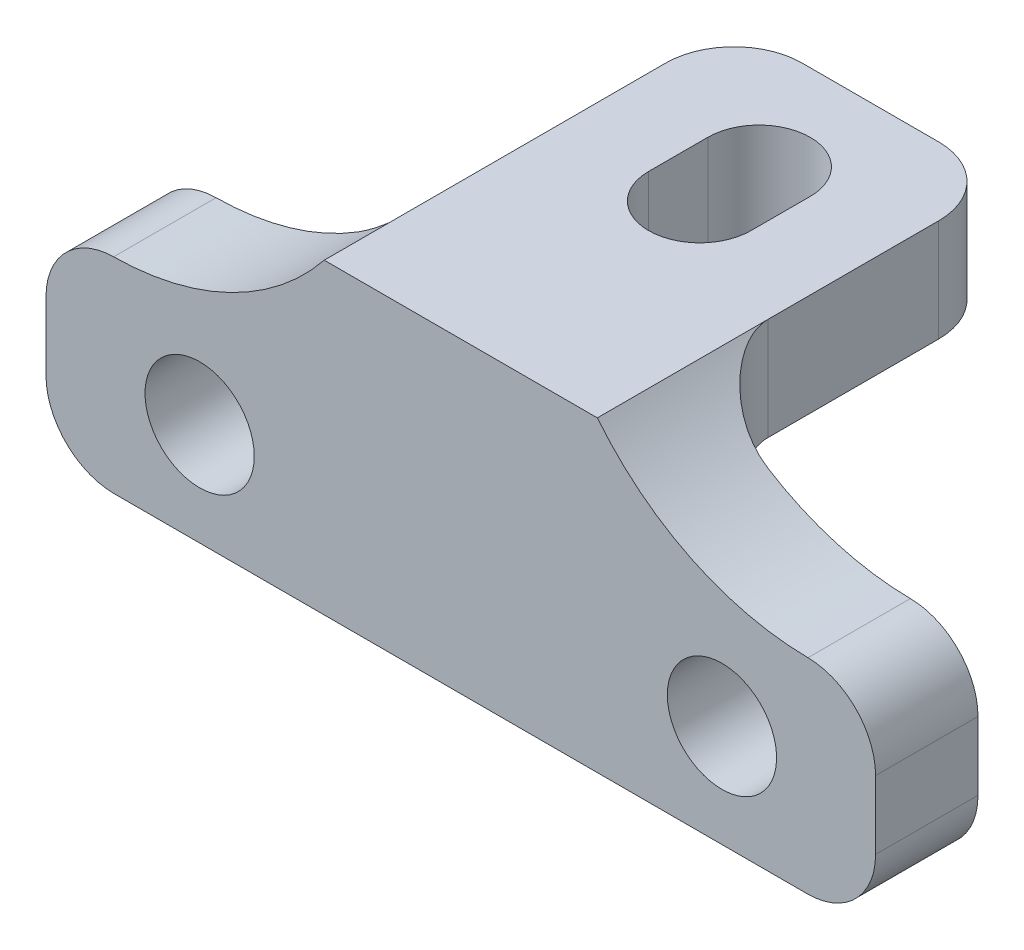
ISO-10303-21;
HEADER;
FILE_DESCRIPTION(('STEP AP214'),'2;1');
FILE_NAME('part.step','',(''),(''),'','','');
FILE_SCHEMA(('AUTOMOTIVE_DESIGN { 1 0 10303 214 1 1 1 1 }'));
ENDSEC;
DATA;
#1=APPLICATION_CONTEXT('core data for automotive mechanical design processes');
#2=APPLICATION_PROTOCOL_DEFINITION('international standard','automotive_design',2000,#1);
#3=PRODUCT_CONTEXT('',#1,'mechanical');
#4=PRODUCT('Part','Part','',(#3));
#5=PRODUCT_RELATED_PRODUCT_CATEGORY('part','',(#4));
#6=PRODUCT_DEFINITION_FORMATION('','',#4);
#7=PRODUCT_DEFINITION_CONTEXT('part definition',#1,'design');
#8=PRODUCT_DEFINITION('design','',#6,#7);
#9=PRODUCT_DEFINITION_SHAPE('','',#8);
#10=(LENGTH_UNIT() NAMED_UNIT(*) SI_UNIT(.MILLI.,.METRE.));
#11=(NAMED_UNIT(*) PLANE_ANGLE_UNIT() SI_UNIT($,.RADIAN.));
#12=(NAMED_UNIT(*) SI_UNIT($,.STERADIAN.) SOLID_ANGLE_UNIT());
#13=UNCERTAINTY_MEASURE_WITH_UNIT(LENGTH_MEASURE(1.E-05),#10,'distance_accuracy_value','');
#14=(GEOMETRIC_REPRESENTATION_CONTEXT(3) GLOBAL_UNCERTAINTY_ASSIGNED_CONTEXT((#13)) GLOBAL_UNIT_ASSIGNED_CONTEXT((#10,
#11,#12)) REPRESENTATION_CONTEXT('',''));
#15=CARTESIAN_POINT('',(0.,0.,0.));
#16=DIRECTION('',(0.,0.,1.));
#17=DIRECTION('',(1.,0.,0.));
#18=AXIS2_PLACEMENT_3D('',#15,#16,#17);
#19=CARTESIAN_POINT('',(-49.506989590494,24.6529411764706,-3.));
#20=DIRECTION('',(-1.,0.,0.));
#21=DIRECTION('',(0.,-1.,0.));
#22=AXIS2_PLACEMENT_3D('',#19,#20,#21);
#23=PLANE('',#22);
#24=DIRECTION('',(0.,-1.,0.));
#25=VECTOR('',#24,1.);
#26=CARTESIAN_POINT('',(-49.506989590494,24.6529411764706,0.));
#27=LINE('',#26,#25);
#28=CARTESIAN_POINT('',(-49.506989590494,22.6533924176365,0.));
#29=VERTEX_POINT('',#28);
#30=CARTESIAN_POINT('',(-49.506989590494,20.6529411764706,0.));
#31=VERTEX_POINT('',#30);
#32=EDGE_CURVE('E250',#29,#31,#27,.T.);
#33=ORIENTED_EDGE('',*,*,#32,.F.);
#34=DIRECTION('',(0.,0.,1.));
#35=VECTOR('',#34,1.);
#36=CARTESIAN_POINT('',(-49.506989590494,22.6533924176365,-3.));
#37=LINE('',#36,#35);
#38=CARTESIAN_POINT('',(-49.506989590494,22.6533924176365,-3.));
#39=VERTEX_POINT('',#38);
#40=EDGE_CURVE('E347',#29,#39,#37,.F.);
#41=ORIENTED_EDGE('',*,*,#40,.T.);
#42=DIRECTION('',(0.,-1.,0.));
#43=VECTOR('',#42,1.);
#44=CARTESIAN_POINT('',(-49.506989590494,24.6529411764706,-3.));
#45=LINE('',#44,#43);
#46=CARTESIAN_POINT('',(-49.506989590494,20.6529411764706,-3.));
#47=VERTEX_POINT('',#46);
#48=EDGE_CURVE('E253',#39,#47,#45,.T.);
#49=ORIENTED_EDGE('',*,*,#48,.T.);
#50=DIRECTION('',(0.,0.,1.));
#51=VECTOR('',#50,1.);
#52=CARTESIAN_POINT('',(-49.506989590494,20.6529411764706,-3.));
#53=LINE('',#52,#51);
#54=EDGE_CURVE('E344',#47,#31,#53,.T.);
#55=ORIENTED_EDGE('',*,*,#54,.T.);
#56=EDGE_LOOP('',(#33,#41,#49,#55));
#57=FACE_BOUND('',#56,.T.);
#58=ADVANCED_FACE('F37',(#57),#23,.T.);
#59=CARTESIAN_POINT('',(-25.206989590494,24.6529411764706,-3.));
#60=DIRECTION('',(1.,0.,0.));
#61=DIRECTION('',(0.,0.,-1.));
#62=AXIS2_PLACEMENT_3D('',#59,#60,#61);
#63=PLANE('',#62);
#64=DIRECTION('',(0.,1.,0.));
#65=VECTOR('',#64,1.);
#66=CARTESIAN_POINT('',(-25.206989590494,24.6529411764706,-3.));
#67=LINE('',#66,#65);
#68=CARTESIAN_POINT('',(-25.206989590494,20.6529411764706,-3.));
#69=VERTEX_POINT('',#68);
#70=CARTESIAN_POINT('',(-25.206989590494,22.6533924176365,-3.));
#71=VERTEX_POINT('',#70);
#72=EDGE_CURVE('E260',#69,#71,#67,.T.);
#73=ORIENTED_EDGE('',*,*,#72,.T.);
#74=DIRECTION('',(0.,0.,-1.));
#75=VECTOR('',#74,1.);
#76=CARTESIAN_POINT('',(-25.206989590494,22.6533924176365,0.));
#77=LINE('',#76,#75);
#78=CARTESIAN_POINT('',(-25.206989590494,22.6533924176365,0.));
#79=VERTEX_POINT('',#78);
#80=EDGE_CURVE('E323',#71,#79,#77,.F.);
#81=ORIENTED_EDGE('',*,*,#80,.T.);
#82=DIRECTION('',(0.,1.,0.));
#83=VECTOR('',#82,1.);
#84=CARTESIAN_POINT('',(-25.206989590494,24.6529411764706,0.));
#85=LINE('',#84,#83);
#86=CARTESIAN_POINT('',(-25.206989590494,20.6529411764706,0.));
#87=VERTEX_POINT('',#86);
#88=EDGE_CURVE('E257',#87,#79,#85,.T.);
#89=ORIENTED_EDGE('',*,*,#88,.F.);
#90=DIRECTION('',(0.,0.,1.));
#91=VECTOR('',#90,1.);
#92=CARTESIAN_POINT('',(-25.206989590494,20.6529411764706,-3.));
#93=LINE('',#92,#91);
#94=EDGE_CURVE('E321',#87,#69,#93,.F.);
#95=ORIENTED_EDGE('',*,*,#94,.T.);
#96=EDGE_LOOP('',(#73,#81,#89,#95));
#97=FACE_BOUND('',#96,.T.);
#98=ADVANCED_FACE('F404',(#97),#63,.T.);
#99=CARTESIAN_POINT('',(-49.506989590494,18.6529411764706,-3.));
#100=DIRECTION('',(0.,-1.,0.));
#101=DIRECTION('',(1.,0.,0.));
#102=AXIS2_PLACEMENT_3D('',#99,#100,#101);
#103=PLANE('',#102);
#104=DIRECTION('',(1.,0.,0.));
#105=VECTOR('',#104,1.);
#106=CARTESIAN_POINT('',(-49.506989590494,18.6529411764706,-3.));
#107=LINE('',#106,#105);
#108=CARTESIAN_POINT('',(-47.506989590494,18.6529411764706,-3.));
#109=VERTEX_POINT('',#108);
#110=CARTESIAN_POINT('',(-27.206989590494,18.6529411764706,-3.));
#111=VERTEX_POINT('',#110);
#112=EDGE_CURVE('E256',#109,#111,#107,.T.);
#113=ORIENTED_EDGE('',*,*,#112,.T.);
#114=DIRECTION('',(0.,0.,1.));
#115=VECTOR('',#114,1.);
#116=CARTESIAN_POINT('',(-27.206989590494,18.6529411764706,-3.));
#117=LINE('',#116,#115);
#118=CARTESIAN_POINT('',(-27.206989590494,18.6529411764706,0.));
#119=VERTEX_POINT('',#118);
#120=EDGE_CURVE('E338',#111,#119,#117,.T.);
#121=ORIENTED_EDGE('',*,*,#120,.T.);
#122=DIRECTION('',(1.,0.,0.));
#123=VECTOR('',#122,1.);
#124=CARTESIAN_POINT('',(-49.506989590494,18.6529411764706,0.));
#125=LINE('',#124,#123);
#126=CARTESIAN_POINT('',(-47.506989590494,18.6529411764706,0.));
#127=VERTEX_POINT('',#126);
#128=EDGE_CURVE('E266',#127,#119,#125,.T.);
#129=ORIENTED_EDGE('',*,*,#128,.F.);
#130=DIRECTION('',(0.,0.,1.));
#131=VECTOR('',#130,1.);
#132=CARTESIAN_POINT('',(-47.506989590494,18.6529411764706,-3.));
#133=LINE('',#132,#131);
#134=EDGE_CURVE('E336',#127,#109,#133,.F.);
#135=ORIENTED_EDGE('',*,*,#134,.T.);
#136=EDGE_LOOP('',(#113,#121,#129,#135));
#137=FACE_BOUND('',#136,.T.);
#138=ADVANCED_FACE('F409',(#137),#103,.T.);
#139=CARTESIAN_POINT('',(0.,0.,-3.));
#140=DIRECTION('',(0.,0.,1.));
#141=DIRECTION('',(1.,0.,0.));
#142=AXIS2_PLACEMENT_3D('',#139,#140,#141);
#143=PLANE('',#142);
#144=CARTESIAN_POINT('',(-29.706989590494,21.6529411764706,-3.));
#145=DIRECTION('',(0.,0.,1.));
#146=DIRECTION('',(-1.,0.,0.));
#147=AXIS2_PLACEMENT_3D('',#144,#145,#146);
#148=CIRCLE('',#147,1.6);
#149=CARTESIAN_POINT('',(-31.306989590494,21.6529411764706,-3.));
#150=VERTEX_POINT('',#149);
#151=EDGE_CURVE('E241',#150,#150,#148,.T.);
#152=ORIENTED_EDGE('',*,*,#151,.T.);
#153=EDGE_LOOP('',(#152));
#154=FACE_BOUND('',#153,.T.);
#155=CARTESIAN_POINT('',(-45.006989590494,21.6529411764706,-3.));
#156=DIRECTION('',(0.,0.,1.));
#157=DIRECTION('',(1.,0.,0.));
#158=AXIS2_PLACEMENT_3D('',#155,#156,#157);
#159=CIRCLE('',#158,1.6);
#160=CARTESIAN_POINT('',(-43.406989590494,21.6529411764706,-3.));
#161=VERTEX_POINT('',#160);
#162=EDGE_CURVE('E247',#161,#161,#159,.T.);
#163=ORIENTED_EDGE('',*,*,#162,.T.);
#164=EDGE_LOOP('',(#163));
#165=FACE_BOUND('',#164,.T.);
#166=CARTESIAN_POINT('',(-27.1119915920956,32.6529411764706,-3.));
#167=DIRECTION('',(0.,0.,1.));
#168=DIRECTION('',(1.,0.,0.));
#169=AXIS2_PLACEMENT_3D('',#166,#167,#168);
#170=CIRCLE('',#169,8.);
#171=CARTESIAN_POINT('',(-31.356989590494,25.8720863635732,-3.));
#172=VERTEX_POINT('',#171);
#173=CARTESIAN_POINT('',(-27.1879899908143,24.6533021694033,-3.));
#174=VERTEX_POINT('',#173);
#175=EDGE_CURVE('E263',#172,#174,#170,.T.);
#176=ORIENTED_EDGE('',*,*,#175,.T.);
#177=CARTESIAN_POINT('',(-27.206989590494,22.6533924176365,-3.));
#178=DIRECTION('',(0.,0.,1.));
#179=DIRECTION('',(1.,0.,0.));
#180=AXIS2_PLACEMENT_3D('',#177,#178,#179);
#181=CIRCLE('',#180,2.);
#182=EDGE_CURVE('E298',#174,#71,#181,.F.);
#183=ORIENTED_EDGE('',*,*,#182,.T.);
#184=ORIENTED_EDGE('',*,*,#72,.F.);
#185=CARTESIAN_POINT('',(-27.206989590494,20.6529411764706,-3.));
#186=DIRECTION('',(0.,0.,1.));
#187=DIRECTION('',(1.,0.,0.));
#188=AXIS2_PLACEMENT_3D('',#185,#186,#187);
#189=CIRCLE('',#188,2.);
#190=EDGE_CURVE('E296',#69,#111,#189,.F.);
#191=ORIENTED_EDGE('',*,*,#190,.T.);
#192=ORIENTED_EDGE('',*,*,#112,.F.);
#193=CARTESIAN_POINT('',(-47.506989590494,20.6529411764706,-3.));
#194=DIRECTION('',(0.,0.,1.));
#195=DIRECTION('',(1.,0.,0.));
#196=AXIS2_PLACEMENT_3D('',#193,#194,#195);
#197=CIRCLE('',#196,2.);
#198=EDGE_CURVE('E292',#109,#47,#197,.F.);
#199=ORIENTED_EDGE('',*,*,#198,.T.);
#200=ORIENTED_EDGE('',*,*,#48,.F.);
#201=CARTESIAN_POINT('',(-47.506989590494,22.6533924176365,-3.));
#202=DIRECTION('',(0.,0.,1.));
#203=DIRECTION('',(1.,0.,0.));
#204=AXIS2_PLACEMENT_3D('',#201,#202,#203);
#205=CIRCLE('',#204,2.);
#206=CARTESIAN_POINT('',(-47.5259891901736,24.6533021694033,-3.));
#207=VERTEX_POINT('',#206);
#208=EDGE_CURVE('E294',#39,#207,#205,.F.);
#209=ORIENTED_EDGE('',*,*,#208,.T.);
#210=CARTESIAN_POINT('',(-47.6019875888923,32.6529411764706,-3.));
#211=DIRECTION('',(0.,0.,1.));
#212=DIRECTION('',(1.,0.,0.));
#213=AXIS2_PLACEMENT_3D('',#210,#211,#212);
#214=CIRCLE('',#213,8.);
#215=CARTESIAN_POINT('',(-43.356989590494,25.8720863635732,-3.));
#216=VERTEX_POINT('',#215);
#217=EDGE_CURVE('E278',#207,#216,#214,.T.);
#218=ORIENTED_EDGE('',*,*,#217,.T.);
#219=DIRECTION('',(0.,1.,0.));
#220=VECTOR('',#219,1.);
#221=CARTESIAN_POINT('',(-43.356989590494,24.6529411764706,-3.));
#222=LINE('',#221,#220);
#223=CARTESIAN_POINT('',(-43.356989590494,22.6529411764706,-3.));
#224=VERTEX_POINT('',#223);
#225=EDGE_CURVE('E288',#216,#224,#222,.F.);
#226=ORIENTED_EDGE('',*,*,#225,.T.);
#227=DIRECTION('',(-1.,0.,0.));
#228=VECTOR('',#227,1.);
#229=CARTESIAN_POINT('',(0.,22.6529411764706,-3.));
#230=LINE('',#229,#228);
#231=CARTESIAN_POINT('',(-31.356989590494,22.6529411764706,-3.));
#232=VERTEX_POINT('',#231);
#233=EDGE_CURVE('E286',#224,#232,#230,.F.);
#234=ORIENTED_EDGE('',*,*,#233,.T.);
#235=DIRECTION('',(0.,-1.,0.));
#236=VECTOR('',#235,1.);
#237=CARTESIAN_POINT('',(-31.356989590494,27.6529411764706,-3.));
#238=LINE('',#237,#236);
#239=EDGE_CURVE('E290',#232,#172,#238,.F.);
#240=ORIENTED_EDGE('',*,*,#239,.T.);
#241=EDGE_LOOP('',(#176,#183,#184,#191,#192,#199,#200,#209,#218,#226,#234,#240));
#242=FACE_BOUND('',#241,.T.);
#243=ADVANCED_FACE('F415',(#154,#165,#242),#143,.F.);
#244=CARTESIAN_POINT('',(0.,0.,0.));
#245=DIRECTION('',(0.,0.,1.));
#246=DIRECTION('',(1.,0.,0.));
#247=AXIS2_PLACEMENT_3D('',#244,#245,#246);
#248=PLANE('',#247);
#249=CARTESIAN_POINT('',(-29.706989590494,21.6529411764706,0.));
#250=DIRECTION('',(0.,0.,1.));
#251=DIRECTION('',(-1.,0.,0.));
#252=AXIS2_PLACEMENT_3D('',#249,#250,#251);
#253=CIRCLE('',#252,1.6);
#254=CARTESIAN_POINT('',(-31.306989590494,21.6529411764706,0.));
#255=VERTEX_POINT('',#254);
#256=EDGE_CURVE('E232',#255,#255,#253,.T.);
#257=ORIENTED_EDGE('',*,*,#256,.F.);
#258=EDGE_LOOP('',(#257));
#259=FACE_BOUND('',#258,.T.);
#260=CARTESIAN_POINT('',(-45.006989590494,21.6529411764706,0.));
#261=DIRECTION('',(0.,0.,1.));
#262=DIRECTION('',(1.,0.,0.));
#263=AXIS2_PLACEMENT_3D('',#260,#261,#262);
#264=CIRCLE('',#263,1.6);
#265=CARTESIAN_POINT('',(-43.406989590494,21.6529411764706,0.));
#266=VERTEX_POINT('',#265);
#267=EDGE_CURVE('E244',#266,#266,#264,.T.);
#268=ORIENTED_EDGE('',*,*,#267,.F.);
#269=EDGE_LOOP('',(#268));
#270=FACE_BOUND('',#269,.T.);
#271=ORIENTED_EDGE('',*,*,#88,.T.);
#272=CARTESIAN_POINT('',(-27.206989590494,22.6533924176365,0.));
#273=DIRECTION('',(0.,0.,1.));
#274=DIRECTION('',(1.,0.,0.));
#275=AXIS2_PLACEMENT_3D('',#272,#273,#274);
#276=CIRCLE('',#275,2.);
#277=CARTESIAN_POINT('',(-27.1879899908143,24.6533021694033,0.));
#278=VERTEX_POINT('',#277);
#279=EDGE_CURVE('E332',#79,#278,#276,.T.);
#280=ORIENTED_EDGE('',*,*,#279,.T.);
#281=CARTESIAN_POINT('',(-27.1119915920956,32.6529411764706,0.));
#282=DIRECTION('',(0.,0.,1.));
#283=DIRECTION('',(1.,0.,0.));
#284=AXIS2_PLACEMENT_3D('',#281,#282,#283);
#285=CIRCLE('',#284,8.);
#286=CARTESIAN_POINT('',(-33.356989590494,27.6529411764706,0.));
#287=VERTEX_POINT('',#286);
#288=EDGE_CURVE('E273',#278,#287,#285,.F.);
#289=ORIENTED_EDGE('',*,*,#288,.T.);
#290=DIRECTION('',(1.,0.,0.));
#291=VECTOR('',#290,1.);
#292=CARTESIAN_POINT('',(-41.356989590494,27.6529411764706,0.));
#293=LINE('',#292,#291);
#294=CARTESIAN_POINT('',(-41.356989590494,27.6529411764706,0.));
#295=VERTEX_POINT('',#294);
#296=EDGE_CURVE('E224',#295,#287,#293,.T.);
#297=ORIENTED_EDGE('',*,*,#296,.F.);
#298=CARTESIAN_POINT('',(-47.6019875888923,32.6529411764706,0.));
#299=DIRECTION('',(0.,0.,1.));
#300=DIRECTION('',(1.,0.,0.));
#301=AXIS2_PLACEMENT_3D('',#298,#299,#300);
#302=CIRCLE('',#301,8.);
#303=CARTESIAN_POINT('',(-47.5259891901736,24.6533021694033,0.));
#304=VERTEX_POINT('',#303);
#305=EDGE_CURVE('E275',#295,#304,#302,.F.);
#306=ORIENTED_EDGE('',*,*,#305,.T.);
#307=CARTESIAN_POINT('',(-47.506989590494,22.6533924176365,0.));
#308=DIRECTION('',(0.,0.,1.));
#309=DIRECTION('',(1.,0.,0.));
#310=AXIS2_PLACEMENT_3D('',#307,#308,#309);
#311=CIRCLE('',#310,2.);
#312=EDGE_CURVE('E328',#304,#29,#311,.T.);
#313=ORIENTED_EDGE('',*,*,#312,.T.);
#314=ORIENTED_EDGE('',*,*,#32,.T.);
#315=CARTESIAN_POINT('',(-47.506989590494,20.6529411764706,0.));
#316=DIRECTION('',(0.,0.,1.));
#317=DIRECTION('',(1.,0.,0.));
#318=AXIS2_PLACEMENT_3D('',#315,#316,#317);
#319=CIRCLE('',#318,2.);
#320=EDGE_CURVE('E326',#31,#127,#319,.T.);
#321=ORIENTED_EDGE('',*,*,#320,.T.);
#322=ORIENTED_EDGE('',*,*,#128,.T.);
#323=CARTESIAN_POINT('',(-27.206989590494,20.6529411764706,0.));
#324=DIRECTION('',(0.,0.,1.));
#325=DIRECTION('',(1.,0.,0.));
#326=AXIS2_PLACEMENT_3D('',#323,#324,#325);
#327=CIRCLE('',#326,2.);
#328=EDGE_CURVE('E330',#119,#87,#327,.T.);
#329=ORIENTED_EDGE('',*,*,#328,.T.);
#330=EDGE_LOOP('',(#271,#280,#289,#297,#306,#313,#314,#321,#322,#329));
#331=FACE_BOUND('',#330,.T.);
#332=ADVANCED_FACE('F418',(#259,#270,#331),#248,.T.);
#333=CARTESIAN_POINT('',(-45.006989590494,21.6529411764706,-3.));
#334=DIRECTION('',(0.,0.,1.));
#335=DIRECTION('',(1.,0.,0.));
#336=AXIS2_PLACEMENT_3D('',#333,#334,#335);
#337=CYLINDRICAL_SURFACE('',#336,1.6);
#338=ORIENTED_EDGE('',*,*,#162,.F.);
#339=EDGE_LOOP('',(#338));
#340=FACE_BOUND('',#339,.T.);
#341=ORIENTED_EDGE('',*,*,#267,.T.);
#342=EDGE_LOOP('',(#341));
#343=FACE_BOUND('',#342,.T.);
#344=ADVANCED_FACE('F421',(#340,#343),#337,.F.);
#345=CARTESIAN_POINT('',(-29.706989590494,21.6529411764706,-3.));
#346=DIRECTION('',(0.,0.,1.));
#347=DIRECTION('',(1.,0.,0.));
#348=AXIS2_PLACEMENT_3D('',#345,#346,#347);
#349=CYLINDRICAL_SURFACE('',#348,1.6);
#350=ORIENTED_EDGE('',*,*,#151,.F.);
#351=EDGE_LOOP('',(#350));
#352=FACE_BOUND('',#351,.T.);
#353=ORIENTED_EDGE('',*,*,#256,.T.);
#354=EDGE_LOOP('',(#353));
#355=FACE_BOUND('',#354,.T.);
#356=ADVANCED_FACE('F428',(#352,#355),#349,.F.);
#357=CARTESIAN_POINT('',(0.,27.6529411764706,0.));
#358=DIRECTION('',(0.,-1.,0.));
#359=DIRECTION('',(0.,0.,-1.));
#360=AXIS2_PLACEMENT_3D('',#357,#358,#359);
#361=PLANE('',#360);
#362=DIRECTION('',(-1.,0.,0.));
#363=VECTOR('',#362,1.);
#364=CARTESIAN_POINT('',(-41.356989590494,27.6529411764706,-12.));
#365=LINE('',#364,#363);
#366=CARTESIAN_POINT('',(-35.356989590494,27.6529411764706,-12.));
#367=VERTEX_POINT('',#366);
#368=CARTESIAN_POINT('',(-39.356989590494,27.6529411764706,-12.));
#369=VERTEX_POINT('',#368);
#370=EDGE_CURVE('E229',#367,#369,#365,.T.);
#371=ORIENTED_EDGE('',*,*,#370,.T.);
#372=CARTESIAN_POINT('',(-39.356989590494,27.6529411764706,-10.));
#373=DIRECTION('',(0.,-1.,0.));
#374=DIRECTION('',(0.,0.,-1.));
#375=AXIS2_PLACEMENT_3D('',#372,#373,#374);
#376=CIRCLE('',#375,2.);
#377=CARTESIAN_POINT('',(-41.356989590494,27.6529411764706,-10.));
#378=VERTEX_POINT('',#377);
#379=EDGE_CURVE('E319',#369,#378,#376,.F.);
#380=ORIENTED_EDGE('',*,*,#379,.T.);
#381=DIRECTION('',(0.,0.,1.));
#382=VECTOR('',#381,1.);
#383=CARTESIAN_POINT('',(-41.356989590494,27.6529411764706,0.));
#384=LINE('',#383,#382);
#385=CARTESIAN_POINT('',(-41.356989590494,27.6529411764706,-5.));
#386=VERTEX_POINT('',#385);
#387=EDGE_CURVE('E221',#378,#386,#384,.T.);
#388=ORIENTED_EDGE('',*,*,#387,.T.);
#389=EDGE_CURVE('E225',#386,#295,#384,.T.);
#390=ORIENTED_EDGE('',*,*,#389,.T.);
#391=ORIENTED_EDGE('',*,*,#296,.T.);
#392=DIRECTION('',(0.,0.,-1.));
#393=VECTOR('',#392,1.);
#394=CARTESIAN_POINT('',(-33.356989590494,27.6529411764706,0.));
#395=LINE('',#394,#393);
#396=CARTESIAN_POINT('',(-33.356989590494,27.6529411764706,-5.));
#397=VERTEX_POINT('',#396);
#398=EDGE_CURVE('E55',#287,#397,#395,.T.);
#399=ORIENTED_EDGE('',*,*,#398,.T.);
#400=CARTESIAN_POINT('',(-33.356989590494,27.6529411764706,-10.));
#401=VERTEX_POINT('',#400);
#402=EDGE_CURVE('E227',#397,#401,#395,.T.);
#403=ORIENTED_EDGE('',*,*,#402,.T.);
#404=CARTESIAN_POINT('',(-35.356989590494,27.6529411764706,-10.));
#405=DIRECTION('',(0.,-1.,0.));
#406=DIRECTION('',(0.,0.,-1.));
#407=AXIS2_PLACEMENT_3D('',#404,#405,#406);
#408=CIRCLE('',#407,2.);
#409=EDGE_CURVE('E317',#401,#367,#408,.F.);
#410=ORIENTED_EDGE('',*,*,#409,.T.);
#411=EDGE_LOOP('',(#371,#380,#388,#390,#391,#399,#403,#410));
#412=FACE_BOUND('',#411,.T.);
#413=CARTESIAN_POINT('',(-37.356989590494,27.6529411764706,-8.7354193943524));
#414=DIRECTION('',(0.,1.,0.));
#415=DIRECTION('',(0.,0.,1.));
#416=AXIS2_PLACEMENT_3D('',#413,#414,#415);
#417=CIRCLE('',#416,1.49999999999999);
#418=CARTESIAN_POINT('',(-35.856989590494,27.6529411764706,-8.7354193943524));
#419=VERTEX_POINT('',#418);
#420=CARTESIAN_POINT('',(-38.856989590494,27.6529411764706,-8.7354193943524));
#421=VERTEX_POINT('',#420);
#422=EDGE_CURVE('E179',#419,#421,#417,.T.);
#423=ORIENTED_EDGE('',*,*,#422,.F.);
#424=DIRECTION('',(0.,0.,-1.));
#425=VECTOR('',#424,1.);
#426=CARTESIAN_POINT('',(-35.856989590494,27.6529411764706,-8.7354193943524));
#427=LINE('',#426,#425);
#428=CARTESIAN_POINT('',(-35.856989590494,27.6529411764706,-7.));
#429=VERTEX_POINT('',#428);
#430=EDGE_CURVE('E205',#429,#419,#427,.T.);
#431=ORIENTED_EDGE('',*,*,#430,.F.);
#432=CARTESIAN_POINT('',(-37.356989590494,27.6529411764706,-7.));
#433=DIRECTION('',(0.,1.,0.));
#434=DIRECTION('',(0.,0.,1.));
#435=AXIS2_PLACEMENT_3D('',#432,#433,#434);
#436=CIRCLE('',#435,1.49999999999999);
#437=CARTESIAN_POINT('',(-38.856989590494,27.6529411764706,-7.));
#438=VERTEX_POINT('',#437);
#439=EDGE_CURVE('E203',#438,#429,#436,.T.);
#440=ORIENTED_EDGE('',*,*,#439,.F.);
#441=DIRECTION('',(0.,0.,1.));
#442=VECTOR('',#441,1.);
#443=CARTESIAN_POINT('',(-38.856989590494,27.6529411764706,-8.7354193943524));
#444=LINE('',#443,#442);
#445=EDGE_CURVE('E189',#421,#438,#444,.T.);
#446=ORIENTED_EDGE('',*,*,#445,.F.);
#447=EDGE_LOOP('',(#423,#431,#440,#446));
#448=FACE_BOUND('',#447,.T.);
#449=ADVANCED_FACE('F201',(#412,#448),#361,.F.);
#450=CARTESIAN_POINT('',(0.,24.6529411764706,0.));
#451=DIRECTION('',(0.,-1.,0.));
#452=DIRECTION('',(0.,0.,-1.));
#453=AXIS2_PLACEMENT_3D('',#450,#451,#452);
#454=PLANE('',#453);
#455=DIRECTION('',(0.,0.,1.));
#456=VECTOR('',#455,1.);
#457=CARTESIAN_POINT('',(-41.356989590494,24.6529411764706,0.));
#458=LINE('',#457,#456);
#459=CARTESIAN_POINT('',(-41.356989590494,24.6529411764706,-10.));
#460=VERTEX_POINT('',#459);
#461=CARTESIAN_POINT('',(-41.356989590494,24.6529411764706,-5.));
#462=VERTEX_POINT('',#461);
#463=EDGE_CURVE('E197',#460,#462,#458,.T.);
#464=ORIENTED_EDGE('',*,*,#463,.F.);
#465=CARTESIAN_POINT('',(-39.356989590494,24.6529411764706,-10.));
#466=DIRECTION('',(0.,-1.,0.));
#467=DIRECTION('',(0.,0.,-1.));
#468=AXIS2_PLACEMENT_3D('',#465,#466,#467);
#469=CIRCLE('',#468,2.);
#470=CARTESIAN_POINT('',(-39.356989590494,24.6529411764706,-12.));
#471=VERTEX_POINT('',#470);
#472=EDGE_CURVE('E310',#460,#471,#469,.T.);
#473=ORIENTED_EDGE('',*,*,#472,.T.);
#474=DIRECTION('',(-1.,0.,0.));
#475=VECTOR('',#474,1.);
#476=CARTESIAN_POINT('',(-41.356989590494,24.6529411764706,-12.));
#477=LINE('',#476,#475);
#478=CARTESIAN_POINT('',(-35.356989590494,24.6529411764706,-12.));
#479=VERTEX_POINT('',#478);
#480=EDGE_CURVE('E238',#479,#471,#477,.T.);
#481=ORIENTED_EDGE('',*,*,#480,.F.);
#482=CARTESIAN_POINT('',(-35.356989590494,24.6529411764706,-10.));
#483=DIRECTION('',(0.,-1.,0.));
#484=DIRECTION('',(0.,0.,-1.));
#485=AXIS2_PLACEMENT_3D('',#482,#483,#484);
#486=CIRCLE('',#485,2.);
#487=CARTESIAN_POINT('',(-33.356989590494,24.6529411764706,-10.));
#488=VERTEX_POINT('',#487);
#489=EDGE_CURVE('E308',#479,#488,#486,.T.);
#490=ORIENTED_EDGE('',*,*,#489,.T.);
#491=DIRECTION('',(0.,0.,-1.));
#492=VECTOR('',#491,1.);
#493=CARTESIAN_POINT('',(-33.356989590494,24.6529411764706,0.));
#494=LINE('',#493,#492);
#495=CARTESIAN_POINT('',(-33.356989590494,24.6529411764706,-5.));
#496=VERTEX_POINT('',#495);
#497=EDGE_CURVE('E235',#496,#488,#494,.T.);
#498=ORIENTED_EDGE('',*,*,#497,.F.);
#499=DIRECTION('',(-1.,0.,0.));
#500=VECTOR('',#499,1.);
#501=CARTESIAN_POINT('',(0.,24.6529411764706,-5.));
#502=LINE('',#501,#500);
#503=EDGE_CURVE('E306',#496,#462,#502,.T.);
#504=ORIENTED_EDGE('',*,*,#503,.T.);
#505=EDGE_LOOP('',(#464,#473,#481,#490,#498,#504));
#506=FACE_BOUND('',#505,.T.);
#507=DIRECTION('',(0.,0.,-1.));
#508=VECTOR('',#507,1.);
#509=CARTESIAN_POINT('',(-35.856989590494,24.6529411764706,-8.7354193943524));
#510=LINE('',#509,#508);
#511=CARTESIAN_POINT('',(-35.856989590494,24.6529411764706,-7.));
#512=VERTEX_POINT('',#511);
#513=CARTESIAN_POINT('',(-35.856989590494,24.6529411764706,-8.7354193943524));
#514=VERTEX_POINT('',#513);
#515=EDGE_CURVE('E190',#512,#514,#510,.T.);
#516=ORIENTED_EDGE('',*,*,#515,.T.);
#517=CARTESIAN_POINT('',(-37.356989590494,24.6529411764706,-8.7354193943524));
#518=DIRECTION('',(0.,1.,0.));
#519=DIRECTION('',(0.,0.,1.));
#520=AXIS2_PLACEMENT_3D('',#517,#518,#519);
#521=CIRCLE('',#520,1.49999999999999);
#522=CARTESIAN_POINT('',(-38.856989590494,24.6529411764706,-8.7354193943524));
#523=VERTEX_POINT('',#522);
#524=EDGE_CURVE('E209',#514,#523,#521,.T.);
#525=ORIENTED_EDGE('',*,*,#524,.T.);
#526=DIRECTION('',(0.,0.,1.));
#527=VECTOR('',#526,1.);
#528=CARTESIAN_POINT('',(-38.856989590494,24.6529411764706,-8.7354193943524));
#529=LINE('',#528,#527);
#530=CARTESIAN_POINT('',(-38.856989590494,24.6529411764706,-7.));
#531=VERTEX_POINT('',#530);
#532=EDGE_CURVE('E196',#523,#531,#529,.T.);
#533=ORIENTED_EDGE('',*,*,#532,.T.);
#534=CARTESIAN_POINT('',(-37.356989590494,24.6529411764706,-7.));
#535=DIRECTION('',(0.,1.,0.));
#536=DIRECTION('',(0.,0.,1.));
#537=AXIS2_PLACEMENT_3D('',#534,#535,#536);
#538=CIRCLE('',#537,1.49999999999999);
#539=EDGE_CURVE('E212',#531,#512,#538,.T.);
#540=ORIENTED_EDGE('',*,*,#539,.T.);
#541=EDGE_LOOP('',(#516,#525,#533,#540));
#542=FACE_BOUND('',#541,.T.);
#543=ADVANCED_FACE('F437',(#506,#542),#454,.T.);
#544=CARTESIAN_POINT('',(-41.356989590494,27.6529411764706,0.));
#545=DIRECTION('',(1.,0.,0.));
#546=DIRECTION('',(0.,0.,-1.));
#547=AXIS2_PLACEMENT_3D('',#544,#545,#546);
#548=PLANE('',#547);
#549=ORIENTED_EDGE('',*,*,#463,.T.);
#550=DIRECTION('',(0.,1.,0.));
#551=VECTOR('',#550,1.);
#552=CARTESIAN_POINT('',(-41.356989590494,27.6529411764706,-5.));
#553=LINE('',#552,#551);
#554=EDGE_CURVE('E303',#462,#386,#553,.T.);
#555=ORIENTED_EDGE('',*,*,#554,.T.);
#556=ORIENTED_EDGE('',*,*,#387,.F.);
#557=DIRECTION('',(0.,-1.,0.));
#558=VECTOR('',#557,1.);
#559=CARTESIAN_POINT('',(-41.356989590494,27.6529411764706,-10.));
#560=LINE('',#559,#558);
#561=EDGE_CURVE('E300',#378,#460,#560,.T.);
#562=ORIENTED_EDGE('',*,*,#561,.T.);
#563=EDGE_LOOP('',(#549,#555,#556,#562));
#564=FACE_BOUND('',#563,.T.);
#565=ADVANCED_FACE('F433',(#564),#548,.F.);
#566=CARTESIAN_POINT('',(-33.356989590494,27.6529411764706,0.));
#567=DIRECTION('',(-1.,0.,0.));
#568=DIRECTION('',(0.,0.,1.));
#569=AXIS2_PLACEMENT_3D('',#566,#567,#568);
#570=PLANE('',#569);
#571=ORIENTED_EDGE('',*,*,#402,.F.);
#572=DIRECTION('',(0.,-1.,0.));
#573=VECTOR('',#572,1.);
#574=CARTESIAN_POINT('',(-33.356989590494,24.6529411764706,-5.));
#575=LINE('',#574,#573);
#576=EDGE_CURVE('E283',#397,#496,#575,.T.);
#577=ORIENTED_EDGE('',*,*,#576,.T.);
#578=ORIENTED_EDGE('',*,*,#497,.T.);
#579=DIRECTION('',(0.,-1.,0.));
#580=VECTOR('',#579,1.);
#581=CARTESIAN_POINT('',(-33.356989590494,27.6529411764706,-10.));
#582=LINE('',#581,#580);
#583=EDGE_CURVE('E281',#488,#401,#582,.F.);
#584=ORIENTED_EDGE('',*,*,#583,.T.);
#585=EDGE_LOOP('',(#571,#577,#578,#584));
#586=FACE_BOUND('',#585,.T.);
#587=ADVANCED_FACE('F436',(#586),#570,.F.);
#588=CARTESIAN_POINT('',(-41.356989590494,27.6529411764706,-12.));
#589=DIRECTION('',(0.,0.,1.));
#590=DIRECTION('',(1.,0.,0.));
#591=AXIS2_PLACEMENT_3D('',#588,#589,#590);
#592=PLANE('',#591);
#593=ORIENTED_EDGE('',*,*,#480,.T.);
#594=DIRECTION('',(0.,-1.,0.));
#595=VECTOR('',#594,1.);
#596=CARTESIAN_POINT('',(-39.356989590494,27.6529411764706,-12.));
#597=LINE('',#596,#595);
#598=EDGE_CURVE('E315',#471,#369,#597,.F.);
#599=ORIENTED_EDGE('',*,*,#598,.T.);
#600=ORIENTED_EDGE('',*,*,#370,.F.);
#601=DIRECTION('',(0.,-1.,0.));
#602=VECTOR('',#601,1.);
#603=CARTESIAN_POINT('',(-35.356989590494,27.6529411764706,-12.));
#604=LINE('',#603,#602);
#605=EDGE_CURVE('E312',#367,#479,#604,.T.);
#606=ORIENTED_EDGE('',*,*,#605,.T.);
#607=EDGE_LOOP('',(#593,#599,#600,#606));
#608=FACE_BOUND('',#607,.T.);
#609=ADVANCED_FACE('F441',(#608),#592,.F.);
#610=CARTESIAN_POINT('',(-37.356989590494,27.6529411764706,-8.7354193943524));
#611=DIRECTION('',(0.,-1.,0.));
#612=DIRECTION('',(0.,0.,-1.));
#613=AXIS2_PLACEMENT_3D('',#610,#611,#612);
#614=CYLINDRICAL_SURFACE('',#613,1.49999999999999);
#615=ORIENTED_EDGE('',*,*,#524,.F.);
#616=DIRECTION('',(0.,-1.,0.));
#617=VECTOR('',#616,1.);
#618=CARTESIAN_POINT('',(-35.856989590494,27.6529411764706,-8.7354193943524));
#619=LINE('',#618,#617);
#620=EDGE_CURVE('E185',#419,#514,#619,.T.);
#621=ORIENTED_EDGE('',*,*,#620,.F.);
#622=ORIENTED_EDGE('',*,*,#422,.T.);
#623=DIRECTION('',(0.,-1.,0.));
#624=VECTOR('',#623,1.);
#625=CARTESIAN_POINT('',(-38.856989590494,27.6529411764706,-8.7354193943524));
#626=LINE('',#625,#624);
#627=EDGE_CURVE('E182',#421,#523,#626,.T.);
#628=ORIENTED_EDGE('',*,*,#627,.T.);
#629=EDGE_LOOP('',(#615,#621,#622,#628));
#630=FACE_BOUND('',#629,.T.);
#631=ADVANCED_FACE('F181',(#630),#614,.F.);
#632=CARTESIAN_POINT('',(-38.856989590494,27.6529411764706,-8.7354193943524));
#633=DIRECTION('',(1.,0.,0.));
#634=DIRECTION('',(0.,0.,-1.));
#635=AXIS2_PLACEMENT_3D('',#632,#633,#634);
#636=PLANE('',#635);
#637=ORIENTED_EDGE('',*,*,#532,.F.);
#638=ORIENTED_EDGE('',*,*,#627,.F.);
#639=ORIENTED_EDGE('',*,*,#445,.T.);
#640=DIRECTION('',(0.,-1.,0.));
#641=VECTOR('',#640,1.);
#642=CARTESIAN_POINT('',(-38.856989590494,27.6529411764706,-7.));
#643=LINE('',#642,#641);
#644=EDGE_CURVE('E198',#438,#531,#643,.T.);
#645=ORIENTED_EDGE('',*,*,#644,.T.);
#646=EDGE_LOOP('',(#637,#638,#639,#645));
#647=FACE_BOUND('',#646,.T.);
#648=ADVANCED_FACE('F193',(#647),#636,.T.);
#649=CARTESIAN_POINT('',(-37.356989590494,27.6529411764706,-7.));
#650=DIRECTION('',(0.,-1.,0.));
#651=DIRECTION('',(0.,0.,-1.));
#652=AXIS2_PLACEMENT_3D('',#649,#650,#651);
#653=CYLINDRICAL_SURFACE('',#652,1.49999999999999);
#654=ORIENTED_EDGE('',*,*,#539,.F.);
#655=ORIENTED_EDGE('',*,*,#644,.F.);
#656=ORIENTED_EDGE('',*,*,#439,.T.);
#657=DIRECTION('',(0.,-1.,0.));
#658=VECTOR('',#657,1.);
#659=CARTESIAN_POINT('',(-35.856989590494,27.6529411764706,-7.));
#660=LINE('',#659,#658);
#661=EDGE_CURVE('E218',#429,#512,#660,.T.);
#662=ORIENTED_EDGE('',*,*,#661,.T.);
#663=EDGE_LOOP('',(#654,#655,#656,#662));
#664=FACE_BOUND('',#663,.T.);
#665=ADVANCED_FACE('F455',(#664),#653,.F.);
#666=CARTESIAN_POINT('',(-35.856989590494,27.6529411764706,-8.7354193943524));
#667=DIRECTION('',(-1.,0.,0.));
#668=DIRECTION('',(0.,0.,1.));
#669=AXIS2_PLACEMENT_3D('',#666,#667,#668);
#670=PLANE('',#669);
#671=ORIENTED_EDGE('',*,*,#515,.F.);
#672=ORIENTED_EDGE('',*,*,#661,.F.);
#673=ORIENTED_EDGE('',*,*,#430,.T.);
#674=ORIENTED_EDGE('',*,*,#620,.T.);
#675=EDGE_LOOP('',(#671,#672,#673,#674));
#676=FACE_BOUND('',#675,.T.);
#677=ADVANCED_FACE('F458',(#676),#670,.T.);
#678=CARTESIAN_POINT('',(-27.1119915920956,32.6529411764706,0.));
#679=DIRECTION('',(0.,0.,1.));
#680=DIRECTION('',(1.,0.,0.));
#681=AXIS2_PLACEMENT_3D('',#678,#679,#680);
#682=CYLINDRICAL_SURFACE('',#681,8.);
#683=ORIENTED_EDGE('',*,*,#288,.F.);
#684=DIRECTION('',(0.,0.,1.));
#685=VECTOR('',#684,1.);
#686=CARTESIAN_POINT('',(-27.1879899908143,24.6533021694033,0.));
#687=LINE('',#686,#685);
#688=EDGE_CURVE('E334',#278,#174,#687,.F.);
#689=ORIENTED_EDGE('',*,*,#688,.T.);
#690=ORIENTED_EDGE('',*,*,#175,.F.);
#691=CARTESIAN_POINT('',(-31.356989590494,25.8720863635732,-3.));
#692=CARTESIAN_POINT('',(-31.4293072983027,25.9173434764668,-3.00000536087597));
#693=CARTESIAN_POINT('',(-31.5008501119297,25.9637564243105,-3.00392115305871));
#694=CARTESIAN_POINT('',(-31.6418298978901,26.058419855725,-3.01911824814616));
#695=CARTESIAN_POINT('',(-31.7112685631826,26.1066687875653,-3.03039345576539));
#696=CARTESIAN_POINT('',(-31.8475159635753,26.2045422009217,-3.05983622680379));
#697=CARTESIAN_POINT('',(-31.914328025417,26.2541647972403,-3.07799473991797));
#698=CARTESIAN_POINT('',(-32.0450540552067,26.354394675238,-3.12082496714361));
#699=CARTESIAN_POINT('',(-32.1089674862464,26.4050021368812,-3.14549788217947));
#700=CARTESIAN_POINT('',(-32.2895072459733,26.5524041158035,-3.22597181686315));
#701=CARTESIAN_POINT('',(-32.4020342491484,26.6499398204703,-3.28985170884851));
#702=CARTESIAN_POINT('',(-32.6137792381018,26.8433899421057,-3.43882457661844));
#703=CARTESIAN_POINT('',(-32.7129929072655,26.9393038244597,-3.5239244071557));
#704=CARTESIAN_POINT('',(-32.8737527369311,27.1020950642713,-3.69251055978538));
#705=CARTESIAN_POINT('',(-32.938616795323,27.1704036156837,-3.77145260880739));
#706=CARTESIAN_POINT('',(-33.0576488578,27.2997339250261,-3.94237251222662));
#707=CARTESIAN_POINT('',(-33.1118345306339,27.360767652799,-4.03432839286412));
#708=CARTESIAN_POINT('',(-33.192983524319,27.4544594044393,-4.20303323233393));
#709=CARTESIAN_POINT('',(-33.2232823428235,27.4902101630859,-4.27644094056796));
#710=CARTESIAN_POINT('',(-33.2756038783739,27.5527897765555,-4.42954247588188));
#711=CARTESIAN_POINT('',(-33.2976570090698,27.5796513754135,-4.50921186384884));
#712=CARTESIAN_POINT('',(-33.3284870959046,27.6175005887784,-4.65696583442659));
#713=CARTESIAN_POINT('',(-33.3390497524854,27.63060302097,-4.7241217976362));
#714=CARTESIAN_POINT('',(-33.3497472503073,27.6439058880108,-4.82647343379373));
#715=CARTESIAN_POINT('',(-33.3524557257327,27.6472823455127,-4.86101536851382));
#716=CARTESIAN_POINT('',(-33.356079548999,27.6518043611532,-4.93036627303478));
#717=CARTESIAN_POINT('',(-33.3569934233623,27.6529480860769,-4.96517543872959));
#718=CARTESIAN_POINT('',(-33.356989590494,27.6529411764706,-5.));
#719=B_SPLINE_CURVE_WITH_KNOTS('',3,(#691,#692,#693,#694,#695,#696,#697,#698,#699,#700,#701,
#702,#703,#704,#705,#706,#707,#708,#709,#710,#711,#712,#713,#714,#715,#716,#717,#718),
.UNSPECIFIED.,.F.,.F.,(4,2,2,2,2,2,2,2,2,2,2,2,2,4),(0.,0.255770051242352,0.51132853450916,
0.766552163447983,1.02182287553459,1.50589604884315,1.99012579707923,2.35777365138203,
2.72480798151068,2.98523150057497,3.2446847612873,3.45150353138273,3.55583216337725,
3.66024641982428),.UNSPECIFIED.);
#720=EDGE_CURVE('E47',#172,#397,#719,.T.);
#721=ORIENTED_EDGE('',*,*,#720,.T.);
#722=ORIENTED_EDGE('',*,*,#398,.F.);
#723=EDGE_LOOP('',(#683,#689,#690,#721,#722));
#724=FACE_BOUND('',#723,.T.);
#725=ADVANCED_FACE('F362',(#724),#682,.F.);
#726=CARTESIAN_POINT('',(-47.6019875888923,32.6529411764706,0.));
#727=DIRECTION('',(0.,0.,-1.));
#728=DIRECTION('',(-1.,0.,0.));
#729=AXIS2_PLACEMENT_3D('',#726,#727,#728);
#730=CYLINDRICAL_SURFACE('',#729,8.);
#731=ORIENTED_EDGE('',*,*,#217,.F.);
#732=DIRECTION('',(0.,0.,-1.));
#733=VECTOR('',#732,1.);
#734=CARTESIAN_POINT('',(-47.5259891901736,24.6533021694033,0.));
#735=LINE('',#734,#733);
#736=EDGE_CURVE('E341',#207,#304,#735,.F.);
#737=ORIENTED_EDGE('',*,*,#736,.T.);
#738=ORIENTED_EDGE('',*,*,#305,.F.);
#739=ORIENTED_EDGE('',*,*,#389,.F.);
#740=CARTESIAN_POINT('',(-41.356989590494,27.6529411764706,-5.));
#741=CARTESIAN_POINT('',(-41.3569757193331,27.6529645964049,-4.95646867163086));
#742=CARTESIAN_POINT('',(-41.358410235603,27.6511668686625,-4.91295417795742));
#743=CARTESIAN_POINT('',(-41.3640663779256,27.6441114295699,-4.82645552012092));
#744=CARTESIAN_POINT('',(-41.3682836354484,27.6388591414567,-4.7834706321187));
#745=CARTESIAN_POINT('',(-41.3793235763144,27.6251659506911,-4.69894497380831));
#746=CARTESIAN_POINT('',(-41.3861114765429,27.6167676324382,-4.65739267061666));
#747=CARTESIAN_POINT('',(-41.4021208684199,27.5970718192469,-4.57546211434669));
#748=CARTESIAN_POINT('',(-41.4113431646305,27.5857733658549,-4.53508425432614));
#749=CARTESIAN_POINT('',(-41.4422440201344,27.5481784958199,-4.41658386892529));
#750=CARTESIAN_POINT('',(-41.4672388524989,27.5180780463545,-4.34049827172859));
#751=CARTESIAN_POINT('',(-41.5246400859274,27.4502656486499,-4.19458874423808));
#752=CARTESIAN_POINT('',(-41.5570755094426,27.4125239648728,-4.1247908647668));
#753=CARTESIAN_POINT('',(-41.6495336768938,27.3073197352802,-3.95155744548379));
#754=CARTESIAN_POINT('',(-41.7143914483301,27.235667374713,-3.8532451916862));
#755=CARTESIAN_POINT('',(-41.8565716951587,27.0850872475806,-3.67259833021969));
#756=CARTESIAN_POINT('',(-41.9339164294504,27.006146598751,-3.59029284433758));
#757=CARTESIAN_POINT('',(-42.1024560048082,26.8417834907679,-3.43810147152491));
#758=CARTESIAN_POINT('',(-42.1940770947027,26.7562281721453,-3.36883420129965));
#759=CARTESIAN_POINT('',(-42.3872687087874,26.584716017768,-3.2471038985134));
#760=CARTESIAN_POINT('',(-42.4888239333239,26.4987599877124,-3.19461554060466));
#761=CARTESIAN_POINT('',(-42.6534864596052,26.3666034721879,-3.12673520892866));
#762=CARTESIAN_POINT('',(-42.7135999773983,26.3197280026014,-3.10522798825272));
#763=CARTESIAN_POINT('',(-42.8362749335705,26.2269087597939,-3.06791151655399));
#764=CARTESIAN_POINT('',(-42.8988360575892,26.1809648680683,-3.05210153644697));
#765=CARTESIAN_POINT('',(-43.0263169578032,26.090215367991,-3.02645060229004));
#766=CARTESIAN_POINT('',(-43.0912440789982,26.0454141975845,-3.01663027918025));
#767=CARTESIAN_POINT('',(-43.2228873839875,25.9574354639563,-3.00340467003917));
#768=CARTESIAN_POINT('',(-43.2896047522768,25.914259023478,-3.00000374304409));
#769=CARTESIAN_POINT('',(-43.356989590494,25.8720863635732,-3.));
#770=B_SPLINE_CURVE_WITH_KNOTS('',3,(#740,#741,#742,#743,#744,#745,#746,#747,#748,#749,#750,
#751,#752,#753,#754,#755,#756,#757,#758,#759,#760,#761,#762,#763,#764,#765,#766,#767,#768,#769),
.UNSPECIFIED.,.F.,.F.,(4,2,2,2,2,2,2,2,2,2,2,2,2,2,4),(0.,0.130506211218832,0.260808031106335,
0.389406336632371,0.518047196924486,0.773521722774099,1.03001021559804,1.44130153106856,
1.85333426618604,2.28163413675481,2.70928446423647,2.94669104693712,3.18406723757036,
3.42225650278079,3.66060745027631),.UNSPECIFIED.);
#771=EDGE_CURVE('E11',#386,#216,#770,.T.);
#772=ORIENTED_EDGE('',*,*,#771,.T.);
#773=EDGE_LOOP('',(#731,#737,#738,#739,#772));
#774=FACE_BOUND('',#773,.T.);
#775=ADVANCED_FACE('F372',(#774),#730,.F.);
#776=CARTESIAN_POINT('',(-43.356989590494,27.6529411764706,-5.));
#777=DIRECTION('',(0.,-1.,0.));
#778=DIRECTION('',(0.,0.,-1.));
#779=AXIS2_PLACEMENT_3D('',#776,#777,#778);
#780=CYLINDRICAL_SURFACE('',#779,2.);
#781=ORIENTED_EDGE('',*,*,#771,.F.);
#782=ORIENTED_EDGE('',*,*,#554,.F.);
#783=CARTESIAN_POINT('',(-43.356989590494,22.6529411764706,-5.));
#784=DIRECTION('',(-0.707106781186547,0.707106781186547,0.));
#785=DIRECTION('',(-0.707106781186547,-0.707106781186547,0.));
#786=AXIS2_PLACEMENT_3D('',#783,#784,#785);
#787=ELLIPSE('',#786,2.82842712474619,2.);
#788=EDGE_CURVE('E41',#224,#462,#787,.T.);
#789=ORIENTED_EDGE('',*,*,#788,.F.);
#790=ORIENTED_EDGE('',*,*,#225,.F.);
#791=EDGE_LOOP('',(#781,#782,#789,#790));
#792=FACE_BOUND('',#791,.T.);
#793=ADVANCED_FACE('F375',(#792),#780,.F.);
#794=CARTESIAN_POINT('',(0.,22.6529411764706,-5.));
#795=DIRECTION('',(-1.,0.,0.));
#796=DIRECTION('',(0.,0.,1.));
#797=AXIS2_PLACEMENT_3D('',#794,#795,#796);
#798=CYLINDRICAL_SURFACE('',#797,2.);
#799=ORIENTED_EDGE('',*,*,#788,.T.);
#800=ORIENTED_EDGE('',*,*,#503,.F.);
#801=CARTESIAN_POINT('',(-31.356989590494,22.6529411764706,-5.));
#802=DIRECTION('',(-0.707106781186547,-0.707106781186547,0.));
#803=DIRECTION('',(-0.707106781186547,0.707106781186547,0.));
#804=AXIS2_PLACEMENT_3D('',#801,#802,#803);
#805=ELLIPSE('',#804,2.82842712474619,2.);
#806=EDGE_CURVE('E507',#232,#496,#805,.T.);
#807=ORIENTED_EDGE('',*,*,#806,.F.);
#808=ORIENTED_EDGE('',*,*,#233,.F.);
#809=EDGE_LOOP('',(#799,#800,#807,#808));
#810=FACE_BOUND('',#809,.T.);
#811=ADVANCED_FACE('F370',(#810),#798,.F.);
#812=CARTESIAN_POINT('',(-31.356989590494,27.6529411764706,-5.));
#813=DIRECTION('',(0.,1.,0.));
#814=DIRECTION('',(0.,0.,1.));
#815=AXIS2_PLACEMENT_3D('',#812,#813,#814);
#816=CYLINDRICAL_SURFACE('',#815,2.);
#817=ORIENTED_EDGE('',*,*,#720,.F.);
#818=ORIENTED_EDGE('',*,*,#239,.F.);
#819=ORIENTED_EDGE('',*,*,#806,.T.);
#820=ORIENTED_EDGE('',*,*,#576,.F.);
#821=EDGE_LOOP('',(#817,#818,#819,#820));
#822=FACE_BOUND('',#821,.T.);
#823=ADVANCED_FACE('F365',(#822),#816,.F.);
#824=CARTESIAN_POINT('',(-39.356989590494,27.6529411764706,-10.));
#825=DIRECTION('',(0.,-1.,0.));
#826=DIRECTION('',(0.,0.,-1.));
#827=AXIS2_PLACEMENT_3D('',#824,#825,#826);
#828=CYLINDRICAL_SURFACE('',#827,2.);
#829=ORIENTED_EDGE('',*,*,#379,.F.);
#830=ORIENTED_EDGE('',*,*,#598,.F.);
#831=ORIENTED_EDGE('',*,*,#472,.F.);
#832=ORIENTED_EDGE('',*,*,#561,.F.);
#833=EDGE_LOOP('',(#829,#830,#831,#832));
#834=FACE_BOUND('',#833,.T.);
#835=ADVANCED_FACE('F369',(#834),#828,.T.);
#836=CARTESIAN_POINT('',(-35.356989590494,27.6529411764706,-10.));
#837=DIRECTION('',(0.,-1.,0.));
#838=DIRECTION('',(0.,0.,-1.));
#839=AXIS2_PLACEMENT_3D('',#836,#837,#838);
#840=CYLINDRICAL_SURFACE('',#839,2.);
#841=ORIENTED_EDGE('',*,*,#409,.F.);
#842=ORIENTED_EDGE('',*,*,#583,.F.);
#843=ORIENTED_EDGE('',*,*,#489,.F.);
#844=ORIENTED_EDGE('',*,*,#605,.F.);
#845=EDGE_LOOP('',(#841,#842,#843,#844));
#846=FACE_BOUND('',#845,.T.);
#847=ADVANCED_FACE('F383',(#846),#840,.T.);
#848=CARTESIAN_POINT('',(-27.206989590494,22.6533924176365,0.));
#849=DIRECTION('',(0.,0.,1.));
#850=DIRECTION('',(1.,0.,0.));
#851=AXIS2_PLACEMENT_3D('',#848,#849,#850);
#852=CYLINDRICAL_SURFACE('',#851,2.);
#853=ORIENTED_EDGE('',*,*,#182,.F.);
#854=ORIENTED_EDGE('',*,*,#688,.F.);
#855=ORIENTED_EDGE('',*,*,#279,.F.);
#856=ORIENTED_EDGE('',*,*,#80,.F.);
#857=EDGE_LOOP('',(#853,#854,#855,#856));
#858=FACE_BOUND('',#857,.T.);
#859=ADVANCED_FACE('F387',(#858),#852,.T.);
#860=CARTESIAN_POINT('',(-27.206989590494,20.6529411764706,-3.));
#861=DIRECTION('',(0.,0.,1.));
#862=DIRECTION('',(1.,0.,0.));
#863=AXIS2_PLACEMENT_3D('',#860,#861,#862);
#864=CYLINDRICAL_SURFACE('',#863,2.);
#865=ORIENTED_EDGE('',*,*,#190,.F.);
#866=ORIENTED_EDGE('',*,*,#94,.F.);
#867=ORIENTED_EDGE('',*,*,#328,.F.);
#868=ORIENTED_EDGE('',*,*,#120,.F.);
#869=EDGE_LOOP('',(#865,#866,#867,#868));
#870=FACE_BOUND('',#869,.T.);
#871=ADVANCED_FACE('F391',(#870),#864,.T.);
#872=CARTESIAN_POINT('',(-47.506989590494,22.6533924176365,0.));
#873=DIRECTION('',(0.,0.,-1.));
#874=DIRECTION('',(-1.,0.,0.));
#875=AXIS2_PLACEMENT_3D('',#872,#873,#874);
#876=CYLINDRICAL_SURFACE('',#875,2.);
#877=ORIENTED_EDGE('',*,*,#208,.F.);
#878=ORIENTED_EDGE('',*,*,#40,.F.);
#879=ORIENTED_EDGE('',*,*,#312,.F.);
#880=ORIENTED_EDGE('',*,*,#736,.F.);
#881=EDGE_LOOP('',(#877,#878,#879,#880));
#882=FACE_BOUND('',#881,.T.);
#883=ADVANCED_FACE('F394',(#882),#876,.T.);
#884=CARTESIAN_POINT('',(-47.506989590494,20.6529411764706,-3.));
#885=DIRECTION('',(0.,0.,1.));
#886=DIRECTION('',(1.,0.,0.));
#887=AXIS2_PLACEMENT_3D('',#884,#885,#886);
#888=CYLINDRICAL_SURFACE('',#887,2.);
#889=ORIENTED_EDGE('',*,*,#198,.F.);
#890=ORIENTED_EDGE('',*,*,#134,.F.);
#891=ORIENTED_EDGE('',*,*,#320,.F.);
#892=ORIENTED_EDGE('',*,*,#54,.F.);
#893=EDGE_LOOP('',(#889,#890,#891,#892));
#894=FACE_BOUND('',#893,.T.);
#895=ADVANCED_FACE('F39',(#894),#888,.T.);
#896=CLOSED_SHELL('',(#58,#98,#138,#243,#332,#344,#356,#449,#543,#565,#587,#609,#631,#648,#665,
#677,#725,#775,#793,#811,#823,#835,#847,#859,#871,#883,#895));
#897=MANIFOLD_SOLID_BREP('B2',#896);
#898=ADVANCED_BREP_SHAPE_REPRESENTATION('',(#18,#897),#14);
#899=SHAPE_DEFINITION_REPRESENTATION(#9,#898);
ENDSEC;
END-ISO-10303-21;
